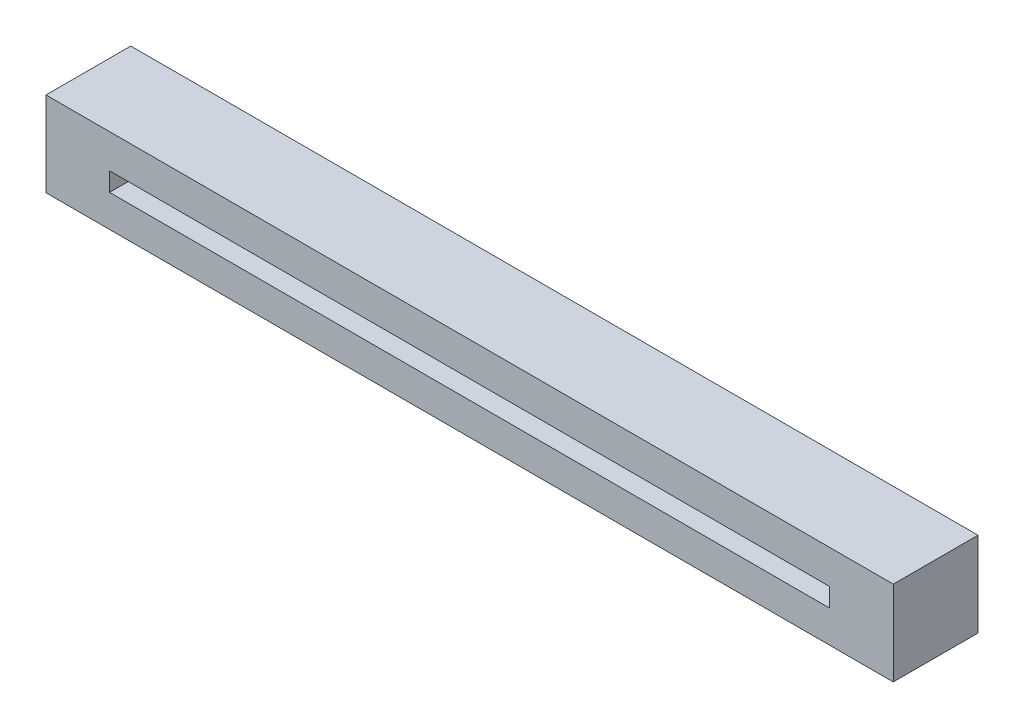
ISO-10303-21;
HEADER;
FILE_DESCRIPTION(('STEP AP214'),'2;1');
FILE_NAME('part.step','',(''),(''),'','','');
FILE_SCHEMA(('AUTOMOTIVE_DESIGN { 1 0 10303 214 1 1 1 1 }'));
ENDSEC;
DATA;
#1=APPLICATION_CONTEXT('core data for automotive mechanical design processes');
#2=APPLICATION_PROTOCOL_DEFINITION('international standard','automotive_design',2000,#1);
#3=PRODUCT_CONTEXT('',#1,'mechanical');
#4=PRODUCT('Part','Part','',(#3));
#5=PRODUCT_RELATED_PRODUCT_CATEGORY('part','',(#4));
#6=PRODUCT_DEFINITION_FORMATION('','',#4);
#7=PRODUCT_DEFINITION_CONTEXT('part definition',#1,'design');
#8=PRODUCT_DEFINITION('design','',#6,#7);
#9=PRODUCT_DEFINITION_SHAPE('','',#8);
#10=(LENGTH_UNIT() NAMED_UNIT(*) SI_UNIT(.MILLI.,.METRE.));
#11=(NAMED_UNIT(*) PLANE_ANGLE_UNIT() SI_UNIT($,.RADIAN.));
#12=(NAMED_UNIT(*) SI_UNIT($,.STERADIAN.) SOLID_ANGLE_UNIT());
#13=UNCERTAINTY_MEASURE_WITH_UNIT(LENGTH_MEASURE(1.E-05),#10,'distance_accuracy_value','');
#14=(GEOMETRIC_REPRESENTATION_CONTEXT(3) GLOBAL_UNCERTAINTY_ASSIGNED_CONTEXT((#13)) GLOBAL_UNIT_ASSIGNED_CONTEXT((#10,
#11,#12)) REPRESENTATION_CONTEXT('',''));
#15=CARTESIAN_POINT('',(0.,0.,0.));
#16=DIRECTION('',(0.,0.,1.));
#17=DIRECTION('',(1.,0.,0.));
#18=AXIS2_PLACEMENT_3D('',#15,#16,#17);
#19=CARTESIAN_POINT('',(-46.8275862068966,-22.3448275862069,12.));
#20=DIRECTION('',(1.,0.,0.));
#21=DIRECTION('',(0.,1.,0.));
#22=AXIS2_PLACEMENT_3D('',#19,#20,#21);
#23=PLANE('',#22);
#24=DIRECTION('',(0.,-1.,0.));
#25=VECTOR('',#24,1.);
#26=CARTESIAN_POINT('',(-46.8275862068966,-22.3448275862069,0.));
#27=LINE('',#26,#25);
#28=CARTESIAN_POINT('',(-46.8275862068966,-22.3448275862069,0.));
#29=VERTEX_POINT('',#28);
#30=CARTESIAN_POINT('',(-46.8275862068966,-34.3448275862069,0.));
#31=VERTEX_POINT('',#30);
#32=EDGE_CURVE('E145',#29,#31,#27,.T.);
#33=ORIENTED_EDGE('',*,*,#32,.T.);
#34=DIRECTION('',(0.,0.,-1.));
#35=VECTOR('',#34,1.);
#36=CARTESIAN_POINT('',(-46.8275862068966,-34.3448275862069,12.));
#37=LINE('',#36,#35);
#38=CARTESIAN_POINT('',(-46.8275862068966,-34.3448275862069,12.));
#39=VERTEX_POINT('',#38);
#40=EDGE_CURVE('E11',#39,#31,#37,.T.);
#41=ORIENTED_EDGE('',*,*,#40,.F.);
#42=DIRECTION('',(0.,-1.,0.));
#43=VECTOR('',#42,1.);
#44=CARTESIAN_POINT('',(-46.8275862068966,-22.3448275862069,12.));
#45=LINE('',#44,#43);
#46=CARTESIAN_POINT('',(-46.8275862068966,-22.3448275862069,12.));
#47=VERTEX_POINT('',#46);
#48=EDGE_CURVE('E149',#47,#39,#45,.T.);
#49=ORIENTED_EDGE('',*,*,#48,.F.);
#50=DIRECTION('',(0.,0.,-1.));
#51=VECTOR('',#50,1.);
#52=CARTESIAN_POINT('',(-46.8275862068966,-22.3448275862069,12.));
#53=LINE('',#52,#51);
#54=EDGE_CURVE('E155',#47,#29,#53,.T.);
#55=ORIENTED_EDGE('',*,*,#54,.T.);
#56=EDGE_LOOP('',(#33,#41,#49,#55));
#57=FACE_BOUND('',#56,.T.);
#58=ADVANCED_FACE('F37',(#57),#23,.F.);
#59=CARTESIAN_POINT('',(-46.8275862068966,-34.3448275862069,12.));
#60=DIRECTION('',(0.,1.,0.));
#61=DIRECTION('',(0.,0.,1.));
#62=AXIS2_PLACEMENT_3D('',#59,#60,#61);
#63=PLANE('',#62);
#64=DIRECTION('',(1.,0.,0.));
#65=VECTOR('',#64,1.);
#66=CARTESIAN_POINT('',(-46.8275862068966,-34.3448275862069,0.));
#67=LINE('',#66,#65);
#68=CARTESIAN_POINT('',(73.1724137931034,-34.3448275862069,0.));
#69=VERTEX_POINT('',#68);
#70=EDGE_CURVE('E158',#31,#69,#67,.T.);
#71=ORIENTED_EDGE('',*,*,#70,.T.);
#72=DIRECTION('',(0.,0.,-1.));
#73=VECTOR('',#72,1.);
#74=CARTESIAN_POINT('',(73.1724137931034,-34.3448275862069,12.));
#75=LINE('',#74,#73);
#76=CARTESIAN_POINT('',(73.1724137931034,-34.3448275862069,12.));
#77=VERTEX_POINT('',#76);
#78=EDGE_CURVE('E44',#77,#69,#75,.T.);
#79=ORIENTED_EDGE('',*,*,#78,.F.);
#80=DIRECTION('',(1.,0.,0.));
#81=VECTOR('',#80,1.);
#82=CARTESIAN_POINT('',(-46.8275862068966,-34.3448275862069,12.));
#83=LINE('',#82,#81);
#84=EDGE_CURVE('E88',#39,#77,#83,.T.);
#85=ORIENTED_EDGE('',*,*,#84,.F.);
#86=ORIENTED_EDGE('',*,*,#40,.T.);
#87=EDGE_LOOP('',(#71,#79,#85,#86));
#88=FACE_BOUND('',#87,.T.);
#89=ADVANCED_FACE('F187',(#88),#63,.F.);
#90=CARTESIAN_POINT('',(73.1724137931034,-22.3448275862069,12.));
#91=DIRECTION('',(-1.,0.,0.));
#92=DIRECTION('',(0.,0.,1.));
#93=AXIS2_PLACEMENT_3D('',#90,#91,#92);
#94=PLANE('',#93);
#95=DIRECTION('',(0.,1.,0.));
#96=VECTOR('',#95,1.);
#97=CARTESIAN_POINT('',(73.1724137931034,-22.3448275862069,0.));
#98=LINE('',#97,#96);
#99=CARTESIAN_POINT('',(73.1724137931034,-22.3448275862069,0.));
#100=VERTEX_POINT('',#99);
#101=EDGE_CURVE('E160',#69,#100,#98,.T.);
#102=ORIENTED_EDGE('',*,*,#101,.T.);
#103=DIRECTION('',(0.,0.,-1.));
#104=VECTOR('',#103,1.);
#105=CARTESIAN_POINT('',(73.1724137931034,-22.3448275862069,12.));
#106=LINE('',#105,#104);
#107=CARTESIAN_POINT('',(73.1724137931034,-22.3448275862069,12.));
#108=VERTEX_POINT('',#107);
#109=EDGE_CURVE('E164',#108,#100,#106,.T.);
#110=ORIENTED_EDGE('',*,*,#109,.F.);
#111=DIRECTION('',(0.,1.,0.));
#112=VECTOR('',#111,1.);
#113=CARTESIAN_POINT('',(73.1724137931034,-22.3448275862069,12.));
#114=LINE('',#113,#112);
#115=EDGE_CURVE('E152',#77,#108,#114,.T.);
#116=ORIENTED_EDGE('',*,*,#115,.F.);
#117=ORIENTED_EDGE('',*,*,#78,.T.);
#118=EDGE_LOOP('',(#102,#110,#116,#117));
#119=FACE_BOUND('',#118,.T.);
#120=ADVANCED_FACE('F169',(#119),#94,.F.);
#121=CARTESIAN_POINT('',(-46.8275862068966,-22.3448275862069,12.));
#122=DIRECTION('',(0.,-1.,0.));
#123=DIRECTION('',(0.,0.,-1.));
#124=AXIS2_PLACEMENT_3D('',#121,#122,#123);
#125=PLANE('',#124);
#126=DIRECTION('',(-1.,0.,0.));
#127=VECTOR('',#126,1.);
#128=CARTESIAN_POINT('',(-46.8275862068966,-22.3448275862069,0.));
#129=LINE('',#128,#127);
#130=EDGE_CURVE('E81',#100,#29,#129,.T.);
#131=ORIENTED_EDGE('',*,*,#130,.T.);
#132=ORIENTED_EDGE('',*,*,#54,.F.);
#133=DIRECTION('',(-1.,0.,0.));
#134=VECTOR('',#133,1.);
#135=CARTESIAN_POINT('',(-46.8275862068966,-22.3448275862069,12.));
#136=LINE('',#135,#134);
#137=EDGE_CURVE('E60',#108,#47,#136,.T.);
#138=ORIENTED_EDGE('',*,*,#137,.F.);
#139=ORIENTED_EDGE('',*,*,#109,.T.);
#140=EDGE_LOOP('',(#131,#132,#138,#139));
#141=FACE_BOUND('',#140,.T.);
#142=ADVANCED_FACE('F177',(#141),#125,.F.);
#143=CARTESIAN_POINT('',(0.,0.,12.));
#144=DIRECTION('',(0.,0.,1.));
#145=DIRECTION('',(1.,0.,0.));
#146=AXIS2_PLACEMENT_3D('',#143,#144,#145);
#147=PLANE('',#146);
#148=DIRECTION('',(0.,-1.,0.));
#149=VECTOR('',#148,1.);
#150=CARTESIAN_POINT('',(-37.8275862068966,-27.1448275862069,12.));
#151=LINE('',#150,#149);
#152=CARTESIAN_POINT('',(-37.8275862068966,-27.1448275862069,12.));
#153=VERTEX_POINT('',#152);
#154=CARTESIAN_POINT('',(-37.8275862068966,-29.7948917742721,12.));
#155=VERTEX_POINT('',#154);
#156=EDGE_CURVE('E51',#153,#155,#151,.T.);
#157=ORIENTED_EDGE('',*,*,#156,.F.);
#158=DIRECTION('',(-1.,0.,0.));
#159=VECTOR('',#158,1.);
#160=CARTESIAN_POINT('',(-37.8275862068966,-27.1448275862069,12.));
#161=LINE('',#160,#159);
#162=CARTESIAN_POINT('',(64.1724137931034,-27.1448275862069,12.));
#163=VERTEX_POINT('',#162);
#164=EDGE_CURVE('E130',#163,#153,#161,.T.);
#165=ORIENTED_EDGE('',*,*,#164,.F.);
#166=DIRECTION('',(0.,1.,0.));
#167=VECTOR('',#166,1.);
#168=CARTESIAN_POINT('',(64.1724137931034,-27.1448275862069,12.));
#169=LINE('',#168,#167);
#170=CARTESIAN_POINT('',(64.1724137931034,-29.7948917742721,12.));
#171=VERTEX_POINT('',#170);
#172=EDGE_CURVE('E133',#171,#163,#169,.T.);
#173=ORIENTED_EDGE('',*,*,#172,.F.);
#174=DIRECTION('',(1.,0.,0.));
#175=VECTOR('',#174,1.);
#176=CARTESIAN_POINT('',(-37.8275862068966,-29.7948917742721,12.));
#177=LINE('',#176,#175);
#178=EDGE_CURVE('E139',#155,#171,#177,.T.);
#179=ORIENTED_EDGE('',*,*,#178,.F.);
#180=EDGE_LOOP('',(#157,#165,#173,#179));
#181=FACE_BOUND('',#180,.T.);
#182=ORIENTED_EDGE('',*,*,#48,.T.);
#183=ORIENTED_EDGE('',*,*,#84,.T.);
#184=ORIENTED_EDGE('',*,*,#115,.T.);
#185=ORIENTED_EDGE('',*,*,#137,.T.);
#186=EDGE_LOOP('',(#182,#183,#184,#185));
#187=FACE_BOUND('',#186,.T.);
#188=ADVANCED_FACE('F179',(#181,#187),#147,.T.);
#189=CARTESIAN_POINT('',(0.,0.,0.));
#190=DIRECTION('',(0.,0.,1.));
#191=DIRECTION('',(1.,0.,0.));
#192=AXIS2_PLACEMENT_3D('',#189,#190,#191);
#193=PLANE('',#192);
#194=ORIENTED_EDGE('',*,*,#32,.F.);
#195=ORIENTED_EDGE('',*,*,#130,.F.);
#196=ORIENTED_EDGE('',*,*,#101,.F.);
#197=ORIENTED_EDGE('',*,*,#70,.F.);
#198=EDGE_LOOP('',(#194,#195,#196,#197));
#199=FACE_BOUND('',#198,.T.);
#200=ADVANCED_FACE('F173',(#199),#193,.F.);
#201=CARTESIAN_POINT('',(-37.8275862068966,-27.1448275862069,4.));
#202=DIRECTION('',(-1.,0.,0.));
#203=DIRECTION('',(0.,0.,1.));
#204=AXIS2_PLACEMENT_3D('',#201,#202,#203);
#205=PLANE('',#204);
#206=ORIENTED_EDGE('',*,*,#156,.T.);
#207=DIRECTION('',(0.,0.,1.));
#208=VECTOR('',#207,1.);
#209=CARTESIAN_POINT('',(-37.8275862068966,-29.7948917742721,4.));
#210=LINE('',#209,#208);
#211=CARTESIAN_POINT('',(-37.8275862068966,-29.7948917742721,4.));
#212=VERTEX_POINT('',#211);
#213=EDGE_CURVE('E108',#212,#155,#210,.T.);
#214=ORIENTED_EDGE('',*,*,#213,.F.);
#215=DIRECTION('',(0.,-1.,0.));
#216=VECTOR('',#215,1.);
#217=CARTESIAN_POINT('',(-37.8275862068966,-27.1448275862069,4.));
#218=LINE('',#217,#216);
#219=CARTESIAN_POINT('',(-37.8275862068966,-27.1448275862069,4.));
#220=VERTEX_POINT('',#219);
#221=EDGE_CURVE('E112',#220,#212,#218,.T.);
#222=ORIENTED_EDGE('',*,*,#221,.F.);
#223=DIRECTION('',(0.,0.,1.));
#224=VECTOR('',#223,1.);
#225=CARTESIAN_POINT('',(-37.8275862068966,-27.1448275862069,4.));
#226=LINE('',#225,#224);
#227=EDGE_CURVE('E143',#220,#153,#226,.T.);
#228=ORIENTED_EDGE('',*,*,#227,.T.);
#229=EDGE_LOOP('',(#206,#214,#222,#228));
#230=FACE_BOUND('',#229,.T.);
#231=ADVANCED_FACE('F110',(#230),#205,.F.);
#232=CARTESIAN_POINT('',(-37.8275862068966,-27.1448275862069,4.));
#233=DIRECTION('',(0.,1.,0.));
#234=DIRECTION('',(0.,0.,1.));
#235=AXIS2_PLACEMENT_3D('',#232,#233,#234);
#236=PLANE('',#235);
#237=ORIENTED_EDGE('',*,*,#164,.T.);
#238=ORIENTED_EDGE('',*,*,#227,.F.);
#239=DIRECTION('',(-1.,0.,0.));
#240=VECTOR('',#239,1.);
#241=CARTESIAN_POINT('',(-37.8275862068966,-27.1448275862069,4.));
#242=LINE('',#241,#240);
#243=CARTESIAN_POINT('',(64.1724137931034,-27.1448275862069,4.));
#244=VERTEX_POINT('',#243);
#245=EDGE_CURVE('E118',#244,#220,#242,.T.);
#246=ORIENTED_EDGE('',*,*,#245,.F.);
#247=DIRECTION('',(0.,0.,1.));
#248=VECTOR('',#247,1.);
#249=CARTESIAN_POINT('',(64.1724137931034,-27.1448275862069,4.));
#250=LINE('',#249,#248);
#251=EDGE_CURVE('E146',#244,#163,#250,.T.);
#252=ORIENTED_EDGE('',*,*,#251,.T.);
#253=EDGE_LOOP('',(#237,#238,#246,#252));
#254=FACE_BOUND('',#253,.T.);
#255=ADVANCED_FACE('F230',(#254),#236,.F.);
#256=CARTESIAN_POINT('',(64.1724137931034,-27.1448275862069,4.));
#257=DIRECTION('',(1.,0.,0.));
#258=DIRECTION('',(0.,0.,-1.));
#259=AXIS2_PLACEMENT_3D('',#256,#257,#258);
#260=PLANE('',#259);
#261=ORIENTED_EDGE('',*,*,#172,.T.);
#262=ORIENTED_EDGE('',*,*,#251,.F.);
#263=DIRECTION('',(0.,1.,0.));
#264=VECTOR('',#263,1.);
#265=CARTESIAN_POINT('',(64.1724137931034,-27.1448275862069,4.));
#266=LINE('',#265,#264);
#267=CARTESIAN_POINT('',(64.1724137931034,-29.7948917742721,4.));
#268=VERTEX_POINT('',#267);
#269=EDGE_CURVE('E126',#268,#244,#266,.T.);
#270=ORIENTED_EDGE('',*,*,#269,.F.);
#271=DIRECTION('',(0.,0.,1.));
#272=VECTOR('',#271,1.);
#273=CARTESIAN_POINT('',(64.1724137931034,-29.7948917742721,4.));
#274=LINE('',#273,#272);
#275=EDGE_CURVE('E117',#268,#171,#274,.T.);
#276=ORIENTED_EDGE('',*,*,#275,.T.);
#277=EDGE_LOOP('',(#261,#262,#270,#276));
#278=FACE_BOUND('',#277,.T.);
#279=ADVANCED_FACE('F240',(#278),#260,.F.);
#280=CARTESIAN_POINT('',(-37.8275862068966,-29.7948917742721,4.));
#281=DIRECTION('',(0.,-1.,0.));
#282=DIRECTION('',(0.,0.,-1.));
#283=AXIS2_PLACEMENT_3D('',#280,#281,#282);
#284=PLANE('',#283);
#285=ORIENTED_EDGE('',*,*,#178,.T.);
#286=ORIENTED_EDGE('',*,*,#275,.F.);
#287=DIRECTION('',(1.,0.,0.));
#288=VECTOR('',#287,1.);
#289=CARTESIAN_POINT('',(-37.8275862068966,-29.7948917742721,4.));
#290=LINE('',#289,#288);
#291=EDGE_CURVE('E121',#212,#268,#290,.T.);
#292=ORIENTED_EDGE('',*,*,#291,.F.);
#293=ORIENTED_EDGE('',*,*,#213,.T.);
#294=EDGE_LOOP('',(#285,#286,#292,#293));
#295=FACE_BOUND('',#294,.T.);
#296=ADVANCED_FACE('F122',(#295),#284,.F.);
#297=CARTESIAN_POINT('',(0.,0.,4.));
#298=DIRECTION('',(0.,0.,1.));
#299=DIRECTION('',(1.,0.,0.));
#300=AXIS2_PLACEMENT_3D('',#297,#298,#299);
#301=PLANE('',#300);
#302=ORIENTED_EDGE('',*,*,#221,.T.);
#303=ORIENTED_EDGE('',*,*,#291,.T.);
#304=ORIENTED_EDGE('',*,*,#269,.T.);
#305=ORIENTED_EDGE('',*,*,#245,.T.);
#306=EDGE_LOOP('',(#302,#303,#304,#305));
#307=FACE_BOUND('',#306,.T.);
#308=ADVANCED_FACE('F128',(#307),#301,.T.);
#309=CLOSED_SHELL('',(#58,#89,#120,#142,#188,#200,#231,#255,#279,#296,#308));
#310=MANIFOLD_SOLID_BREP('B2',#309);
#311=ADVANCED_BREP_SHAPE_REPRESENTATION('',(#18,#310),#14);
#312=SHAPE_DEFINITION_REPRESENTATION(#9,#311);
ENDSEC;
END-ISO-10303-21;
